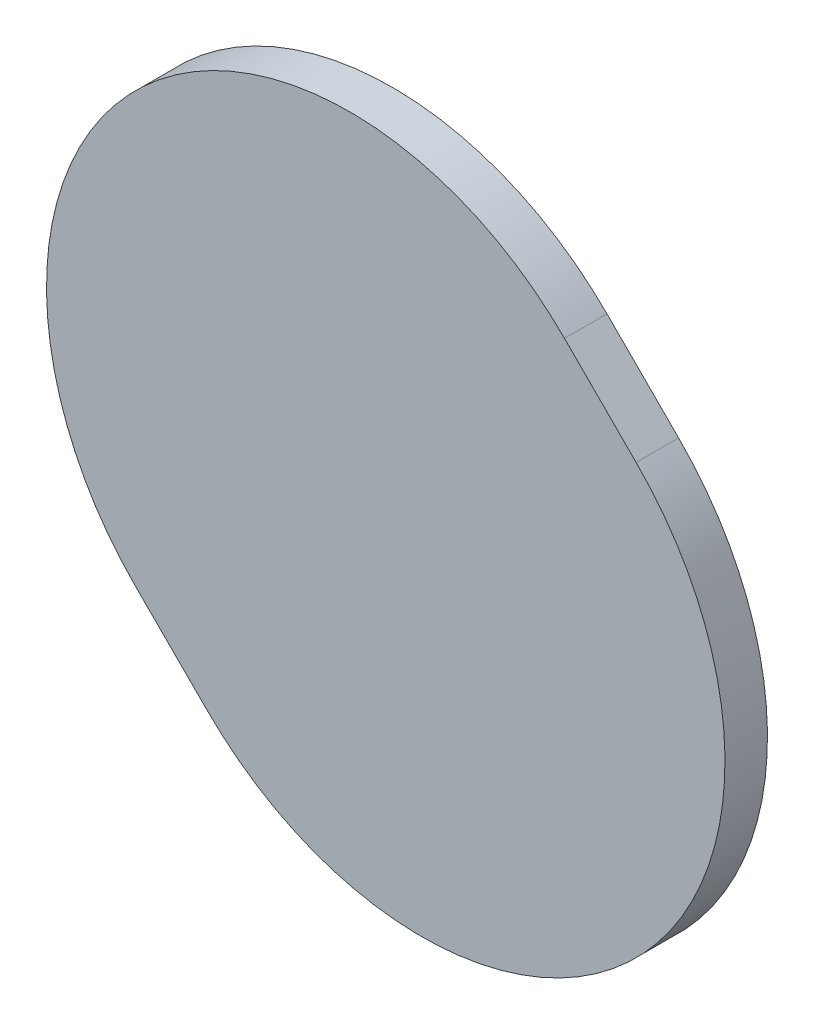
ISO-10303-21;
HEADER;
FILE_DESCRIPTION(('STEP AP214'),'2;1');
FILE_NAME('part.step','',(''),(''),'','','');
FILE_SCHEMA(('AUTOMOTIVE_DESIGN { 1 0 10303 214 1 1 1 1 }'));
ENDSEC;
DATA;
#1=APPLICATION_CONTEXT('core data for automotive mechanical design processes');
#2=APPLICATION_PROTOCOL_DEFINITION('international standard','automotive_design',2000,#1);
#3=PRODUCT_CONTEXT('',#1,'mechanical');
#4=PRODUCT('Part','Part','',(#3));
#5=PRODUCT_RELATED_PRODUCT_CATEGORY('part','',(#4));
#6=PRODUCT_DEFINITION_FORMATION('','',#4);
#7=PRODUCT_DEFINITION_CONTEXT('part definition',#1,'design');
#8=PRODUCT_DEFINITION('design','',#6,#7);
#9=PRODUCT_DEFINITION_SHAPE('','',#8);
#10=(LENGTH_UNIT() NAMED_UNIT(*) SI_UNIT(.MILLI.,.METRE.));
#11=(NAMED_UNIT(*) PLANE_ANGLE_UNIT() SI_UNIT($,.RADIAN.));
#12=(NAMED_UNIT(*) SI_UNIT($,.STERADIAN.) SOLID_ANGLE_UNIT());
#13=UNCERTAINTY_MEASURE_WITH_UNIT(LENGTH_MEASURE(1.E-05),#10,'distance_accuracy_value','');
#14=(GEOMETRIC_REPRESENTATION_CONTEXT(3) GLOBAL_UNCERTAINTY_ASSIGNED_CONTEXT((#13)) GLOBAL_UNIT_ASSIGNED_CONTEXT((#10,
#11,#12)) REPRESENTATION_CONTEXT('',''));
#15=CARTESIAN_POINT('',(0.,0.,0.));
#16=DIRECTION('',(0.,0.,1.));
#17=DIRECTION('',(1.,0.,0.));
#18=AXIS2_PLACEMENT_3D('',#15,#16,#17);
#19=CARTESIAN_POINT('',(132.905776,-109.622223,1.635));
#20=DIRECTION('',(0.,0.,1.));
#21=DIRECTION('',(1.,0.,0.));
#22=AXIS2_PLACEMENT_3D('',#19,#20,#21);
#23=PLANE('',#22);
#24=DIRECTION('',(-0.707106781186048,0.707106781187048,0.));
#25=VECTOR('',#24,1.);
#26=CARTESIAN_POINT('',(132.905776,-109.622223,1.635));
#27=LINE('',#26,#25);
#28=CARTESIAN_POINT('',(132.905776,-109.622223,1.635));
#29=VERTEX_POINT('',#28);
#30=CARTESIAN_POINT('',(132.846776,-109.563223,1.635));
#31=VERTEX_POINT('',#30);
#32=EDGE_CURVE('E81',#29,#31,#27,.T.);
#33=ORIENTED_EDGE('',*,*,#32,.T.);
#34=CARTESIAN_POINT('',(132.6699995,-109.7399995,1.635));
#35=DIRECTION('',(0.,0.,1.));
#36=DIRECTION('',(0.707106781186548,0.707106781186548,0.));
#37=AXIS2_PLACEMENT_3D('',#34,#35,#36);
#38=CIRCLE('',#37,0.249999723809);
#39=CARTESIAN_POINT('',(132.493223,-109.916776,1.635));
#40=VERTEX_POINT('',#39);
#41=EDGE_CURVE('E107',#31,#40,#38,.T.);
#42=ORIENTED_EDGE('',*,*,#41,.T.);
#43=DIRECTION('',(0.707106781186548,-0.707106781186548,0.));
#44=VECTOR('',#43,1.);
#45=CARTESIAN_POINT('',(132.493223,-109.916776,1.635));
#46=LINE('',#45,#44);
#47=CARTESIAN_POINT('',(132.552223,-109.975776,1.635));
#48=VERTEX_POINT('',#47);
#49=EDGE_CURVE('E74',#40,#48,#46,.T.);
#50=ORIENTED_EDGE('',*,*,#49,.T.);
#51=CARTESIAN_POINT('',(132.7289995,-109.7989995,1.635));
#52=DIRECTION('',(0.,0.,1.));
#53=DIRECTION('',(-0.707106781186548,-0.707106781186548,0.));
#54=AXIS2_PLACEMENT_3D('',#51,#52,#53);
#55=CIRCLE('',#54,0.249999723809);
#56=EDGE_CURVE('E11',#48,#29,#55,.T.);
#57=ORIENTED_EDGE('',*,*,#56,.T.);
#58=EDGE_LOOP('',(#33,#42,#50,#57));
#59=FACE_BOUND('',#58,.T.);
#60=ADVANCED_FACE('F17',(#59),#23,.T.);
#61=CARTESIAN_POINT('',(132.905776,-109.622223,1.6));
#62=DIRECTION('',(0.,0.,1.));
#63=DIRECTION('',(1.,0.,0.));
#64=AXIS2_PLACEMENT_3D('',#61,#62,#63);
#65=PLANE('',#64);
#66=CARTESIAN_POINT('',(132.7289995,-109.7989995,1.6));
#67=DIRECTION('',(0.,0.,1.));
#68=DIRECTION('',(-0.707106781186548,-0.707106781186548,0.));
#69=AXIS2_PLACEMENT_3D('',#66,#67,#68);
#70=CIRCLE('',#69,0.249999723809);
#71=CARTESIAN_POINT('',(132.552223,-109.975776,1.6));
#72=VERTEX_POINT('',#71);
#73=CARTESIAN_POINT('',(132.905776,-109.622223,1.6));
#74=VERTEX_POINT('',#73);
#75=EDGE_CURVE('E25',#72,#74,#70,.T.);
#76=ORIENTED_EDGE('',*,*,#75,.F.);
#77=DIRECTION('',(0.707106781186548,-0.707106781186548,0.));
#78=VECTOR('',#77,1.);
#79=CARTESIAN_POINT('',(132.493223,-109.916776,1.6));
#80=LINE('',#79,#78);
#81=CARTESIAN_POINT('',(132.493223,-109.916776,1.6));
#82=VERTEX_POINT('',#81);
#83=EDGE_CURVE('E111',#82,#72,#80,.T.);
#84=ORIENTED_EDGE('',*,*,#83,.F.);
#85=CARTESIAN_POINT('',(132.6699995,-109.7399995,1.6));
#86=DIRECTION('',(0.,0.,1.));
#87=DIRECTION('',(0.707106781186548,0.707106781186548,0.));
#88=AXIS2_PLACEMENT_3D('',#85,#86,#87);
#89=CIRCLE('',#88,0.249999723809);
#90=CARTESIAN_POINT('',(132.846776,-109.563223,1.6));
#91=VERTEX_POINT('',#90);
#92=EDGE_CURVE('E83',#91,#82,#89,.T.);
#93=ORIENTED_EDGE('',*,*,#92,.F.);
#94=DIRECTION('',(-0.707106781186048,0.707106781187048,0.));
#95=VECTOR('',#94,1.);
#96=CARTESIAN_POINT('',(132.905776,-109.622223,1.6));
#97=LINE('',#96,#95);
#98=EDGE_CURVE('E79',#74,#91,#97,.T.);
#99=ORIENTED_EDGE('',*,*,#98,.F.);
#100=EDGE_LOOP('',(#76,#84,#93,#99));
#101=FACE_BOUND('',#100,.T.);
#102=ADVANCED_FACE('F85',(#101),#65,.F.);
#103=CARTESIAN_POINT('',(132.7289995,-109.7989995,1.6));
#104=DIRECTION('',(0.,0.,-1.));
#105=DIRECTION('',(-0.707106781186548,-0.707106781186548,0.));
#106=AXIS2_PLACEMENT_3D('',#103,#104,#105);
#107=CYLINDRICAL_SURFACE('',#106,0.249999723809);
#108=ORIENTED_EDGE('',*,*,#75,.T.);
#109=DIRECTION('',(0.,0.,1.));
#110=VECTOR('',#109,1.);
#111=CARTESIAN_POINT('',(132.905776,-109.622223,1.6));
#112=LINE('',#111,#110);
#113=EDGE_CURVE('E68',#74,#29,#112,.T.);
#114=ORIENTED_EDGE('',*,*,#113,.T.);
#115=ORIENTED_EDGE('',*,*,#56,.F.);
#116=DIRECTION('',(0.,0.,1.));
#117=VECTOR('',#116,1.);
#118=CARTESIAN_POINT('',(132.552223,-109.975776,1.6));
#119=LINE('',#118,#117);
#120=EDGE_CURVE('E71',#72,#48,#119,.T.);
#121=ORIENTED_EDGE('',*,*,#120,.F.);
#122=EDGE_LOOP('',(#108,#114,#115,#121));
#123=FACE_BOUND('',#122,.T.);
#124=ADVANCED_FACE('F67',(#123),#107,.T.);
#125=CARTESIAN_POINT('',(132.493223,-109.916776,1.6));
#126=DIRECTION('',(0.707106781186548,0.707106781186548,0.));
#127=DIRECTION('',(0.,0.,-1.));
#128=AXIS2_PLACEMENT_3D('',#125,#126,#127);
#129=PLANE('',#128);
#130=ORIENTED_EDGE('',*,*,#83,.T.);
#131=ORIENTED_EDGE('',*,*,#120,.T.);
#132=ORIENTED_EDGE('',*,*,#49,.F.);
#133=DIRECTION('',(0.,0.,1.));
#134=VECTOR('',#133,1.);
#135=CARTESIAN_POINT('',(132.493223,-109.916776,1.6));
#136=LINE('',#135,#134);
#137=EDGE_CURVE('E103',#82,#40,#136,.T.);
#138=ORIENTED_EDGE('',*,*,#137,.F.);
#139=EDGE_LOOP('',(#130,#131,#132,#138));
#140=FACE_BOUND('',#139,.T.);
#141=ADVANCED_FACE('F118',(#140),#129,.F.);
#142=CARTESIAN_POINT('',(132.6699995,-109.7399995,1.6));
#143=DIRECTION('',(0.,0.,-1.));
#144=DIRECTION('',(0.707106781186548,0.707106781186548,0.));
#145=AXIS2_PLACEMENT_3D('',#142,#143,#144);
#146=CYLINDRICAL_SURFACE('',#145,0.249999723809);
#147=ORIENTED_EDGE('',*,*,#92,.T.);
#148=ORIENTED_EDGE('',*,*,#137,.T.);
#149=ORIENTED_EDGE('',*,*,#41,.F.);
#150=DIRECTION('',(0.,0.,1.));
#151=VECTOR('',#150,1.);
#152=CARTESIAN_POINT('',(132.846776,-109.563223,1.6));
#153=LINE('',#152,#151);
#154=EDGE_CURVE('E89',#91,#31,#153,.T.);
#155=ORIENTED_EDGE('',*,*,#154,.F.);
#156=EDGE_LOOP('',(#147,#148,#149,#155));
#157=FACE_BOUND('',#156,.T.);
#158=ADVANCED_FACE('F121',(#157),#146,.T.);
#159=CARTESIAN_POINT('',(132.905776,-109.622223,1.6));
#160=DIRECTION('',(-0.707106781187048,-0.707106781186048,0.));
#161=DIRECTION('',(-0.707106781186048,0.707106781187048,0.));
#162=AXIS2_PLACEMENT_3D('',#159,#160,#161);
#163=PLANE('',#162);
#164=ORIENTED_EDGE('',*,*,#98,.T.);
#165=ORIENTED_EDGE('',*,*,#154,.T.);
#166=ORIENTED_EDGE('',*,*,#32,.F.);
#167=ORIENTED_EDGE('',*,*,#113,.F.);
#168=EDGE_LOOP('',(#164,#165,#166,#167));
#169=FACE_BOUND('',#168,.T.);
#170=ADVANCED_FACE('F77',(#169),#163,.F.);
#171=CLOSED_SHELL('',(#60,#102,#124,#141,#158,#170));
#172=MANIFOLD_SOLID_BREP('B1',#171);
#173=ADVANCED_BREP_SHAPE_REPRESENTATION('',(#18,#172),#14);
#174=SHAPE_DEFINITION_REPRESENTATION(#9,#173);
ENDSEC;
END-ISO-10303-21;
